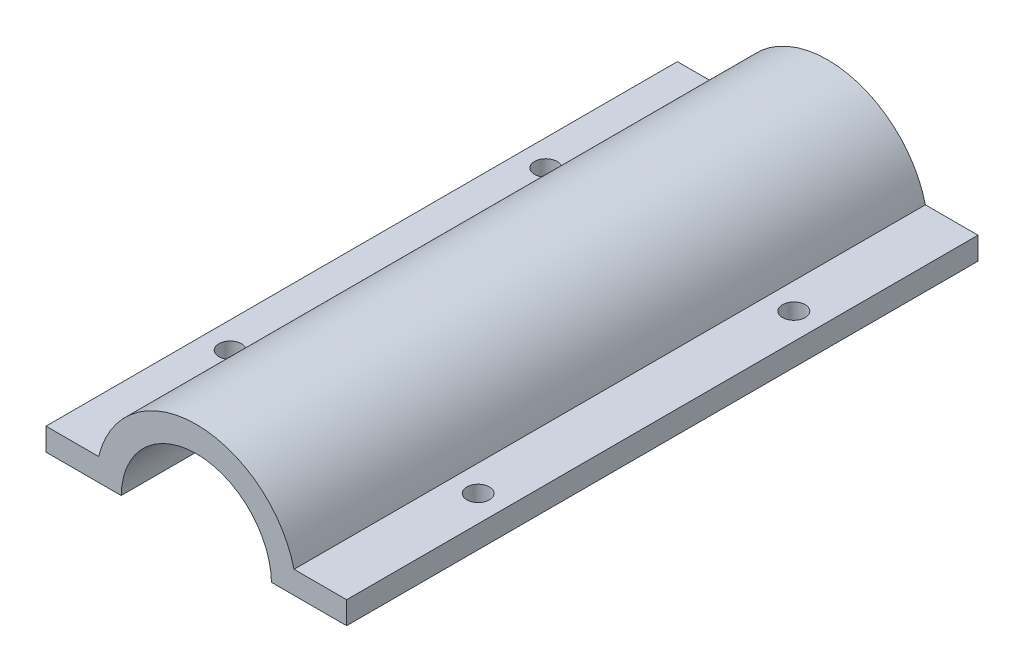
ISO-10303-21;
HEADER;
FILE_DESCRIPTION(('STEP AP214'),'2;1');
FILE_NAME('part.step','',(''),(''),'','','');
FILE_SCHEMA(('AUTOMOTIVE_DESIGN { 1 0 10303 214 1 1 1 1 }'));
ENDSEC;
DATA;
#1=APPLICATION_CONTEXT('core data for automotive mechanical design processes');
#2=APPLICATION_PROTOCOL_DEFINITION('international standard','automotive_design',2000,#1);
#3=PRODUCT_CONTEXT('',#1,'mechanical');
#4=PRODUCT('Part','Part','',(#3));
#5=PRODUCT_RELATED_PRODUCT_CATEGORY('part','',(#4));
#6=PRODUCT_DEFINITION_FORMATION('','',#4);
#7=PRODUCT_DEFINITION_CONTEXT('part definition',#1,'design');
#8=PRODUCT_DEFINITION('design','',#6,#7);
#9=PRODUCT_DEFINITION_SHAPE('','',#8);
#10=(LENGTH_UNIT() NAMED_UNIT(*) SI_UNIT(.MILLI.,.METRE.));
#11=(NAMED_UNIT(*) PLANE_ANGLE_UNIT() SI_UNIT($,.RADIAN.));
#12=(NAMED_UNIT(*) SI_UNIT($,.STERADIAN.) SOLID_ANGLE_UNIT());
#13=UNCERTAINTY_MEASURE_WITH_UNIT(LENGTH_MEASURE(1.E-05),#10,'distance_accuracy_value','');
#14=(GEOMETRIC_REPRESENTATION_CONTEXT(3) GLOBAL_UNCERTAINTY_ASSIGNED_CONTEXT((#13)) GLOBAL_UNIT_ASSIGNED_CONTEXT((#10,
#11,#12)) REPRESENTATION_CONTEXT('',''));
#15=CARTESIAN_POINT('',(0.,0.,0.));
#16=DIRECTION('',(0.,0.,1.));
#17=DIRECTION('',(1.,0.,0.));
#18=AXIS2_PLACEMENT_3D('',#15,#16,#17);
#19=CARTESIAN_POINT('',(0.,0.,84.));
#20=DIRECTION('',(0.,0.,-1.));
#21=DIRECTION('',(-1.,0.,0.));
#22=AXIS2_PLACEMENT_3D('',#19,#20,#21);
#23=CYLINDRICAL_SURFACE('',#22,10.);
#24=CARTESIAN_POINT('',(0.,0.,0.));
#25=DIRECTION('',(0.,0.,-1.));
#26=DIRECTION('',(-1.,0.,0.));
#27=AXIS2_PLACEMENT_3D('',#24,#25,#26);
#28=CIRCLE('',#27,10.);
#29=CARTESIAN_POINT('',(-9.99847695156391,0.174524064372796,0.));
#30=VERTEX_POINT('',#29);
#31=CARTESIAN_POINT('',(9.99847695156391,0.174524064372799,0.));
#32=VERTEX_POINT('',#31);
#33=EDGE_CURVE('E92',#30,#32,#28,.T.);
#34=ORIENTED_EDGE('',*,*,#33,.T.);
#35=DIRECTION('',(0.,0.,-1.));
#36=VECTOR('',#35,1.);
#37=CARTESIAN_POINT('',(9.99847695156391,0.174524064372799,84.));
#38=LINE('',#37,#36);
#39=CARTESIAN_POINT('',(9.99847695156391,0.174524064372799,84.));
#40=VERTEX_POINT('',#39);
#41=EDGE_CURVE('E11',#40,#32,#38,.T.);
#42=ORIENTED_EDGE('',*,*,#41,.F.);
#43=CARTESIAN_POINT('',(0.,0.,84.));
#44=DIRECTION('',(0.,0.,-1.));
#45=DIRECTION('',(1.,0.,0.));
#46=AXIS2_PLACEMENT_3D('',#43,#44,#45);
#47=CIRCLE('',#46,10.);
#48=CARTESIAN_POINT('',(-9.99847695156391,0.174524064372796,84.));
#49=VERTEX_POINT('',#48);
#50=EDGE_CURVE('E98',#49,#40,#47,.T.);
#51=ORIENTED_EDGE('',*,*,#50,.F.);
#52=DIRECTION('',(0.,0.,-1.));
#53=VECTOR('',#52,1.);
#54=CARTESIAN_POINT('',(-9.99847695156391,0.174524064372796,84.));
#55=LINE('',#54,#53);
#56=EDGE_CURVE('E136',#49,#30,#55,.T.);
#57=ORIENTED_EDGE('',*,*,#56,.T.);
#58=EDGE_LOOP('',(#34,#42,#51,#57));
#59=FACE_BOUND('',#58,.T.);
#60=ADVANCED_FACE('F39',(#59),#23,.F.);
#61=CARTESIAN_POINT('',(9.99847695156391,0.1745240643728,84.));
#62=DIRECTION('',(0.,1.,0.));
#63=DIRECTION('',(0.,0.,1.));
#64=AXIS2_PLACEMENT_3D('',#61,#62,#63);
#65=PLANE('',#64);
#66=CARTESIAN_POINT('',(16.4984769515639,0.174524064372796,21.));
#67=DIRECTION('',(0.,1.,0.));
#68=DIRECTION('',(0.,0.,1.));
#69=AXIS2_PLACEMENT_3D('',#66,#67,#68);
#70=CIRCLE('',#69,1.5);
#71=CARTESIAN_POINT('',(16.4984769515639,0.174524064372796,22.5));
#72=VERTEX_POINT('',#71);
#73=EDGE_CURVE('E220',#72,#72,#70,.T.);
#74=ORIENTED_EDGE('',*,*,#73,.T.);
#75=EDGE_LOOP('',(#74));
#76=FACE_BOUND('',#75,.T.);
#77=CARTESIAN_POINT('',(16.4984769515639,0.174524064372796,63.));
#78=DIRECTION('',(0.,1.,0.));
#79=DIRECTION('',(0.,0.,1.));
#80=AXIS2_PLACEMENT_3D('',#77,#78,#79);
#81=CIRCLE('',#80,1.5);
#82=CARTESIAN_POINT('',(16.4984769515639,0.174524064372796,64.5));
#83=VERTEX_POINT('',#82);
#84=EDGE_CURVE('E221',#83,#83,#81,.T.);
#85=ORIENTED_EDGE('',*,*,#84,.T.);
#86=EDGE_LOOP('',(#85));
#87=FACE_BOUND('',#86,.T.);
#88=DIRECTION('',(1.,0.,0.));
#89=VECTOR('',#88,1.);
#90=CARTESIAN_POINT('',(9.99847695156391,0.1745240643728,0.));
#91=LINE('',#90,#89);
#92=CARTESIAN_POINT('',(19.9984769515639,0.1745240643728,0.));
#93=VERTEX_POINT('',#92);
#94=EDGE_CURVE('E142',#32,#93,#91,.T.);
#95=ORIENTED_EDGE('',*,*,#94,.T.);
#96=DIRECTION('',(0.,0.,-1.));
#97=VECTOR('',#96,1.);
#98=CARTESIAN_POINT('',(19.9984769515639,0.1745240643728,84.));
#99=LINE('',#98,#97);
#100=CARTESIAN_POINT('',(19.9984769515639,0.1745240643728,84.));
#101=VERTEX_POINT('',#100);
#102=EDGE_CURVE('E48',#101,#93,#99,.T.);
#103=ORIENTED_EDGE('',*,*,#102,.F.);
#104=DIRECTION('',(1.,0.,0.));
#105=VECTOR('',#104,1.);
#106=CARTESIAN_POINT('',(9.99847695156391,0.1745240643728,84.));
#107=LINE('',#106,#105);
#108=EDGE_CURVE('E203',#40,#101,#107,.T.);
#109=ORIENTED_EDGE('',*,*,#108,.F.);
#110=ORIENTED_EDGE('',*,*,#41,.T.);
#111=EDGE_LOOP('',(#95,#103,#109,#110));
#112=FACE_BOUND('',#111,.T.);
#113=ADVANCED_FACE('F240',(#76,#87,#112),#65,.F.);
#114=CARTESIAN_POINT('',(19.9984769515639,0.1745240643728,84.));
#115=DIRECTION('',(-1.,0.,0.));
#116=DIRECTION('',(0.,0.,1.));
#117=AXIS2_PLACEMENT_3D('',#114,#115,#116);
#118=PLANE('',#117);
#119=DIRECTION('',(0.,1.,0.));
#120=VECTOR('',#119,1.);
#121=CARTESIAN_POINT('',(19.9984769515639,0.1745240643728,0.));
#122=LINE('',#121,#120);
#123=CARTESIAN_POINT('',(19.9984769515639,3.1745240643728,0.));
#124=VERTEX_POINT('',#123);
#125=EDGE_CURVE('E146',#93,#124,#122,.T.);
#126=ORIENTED_EDGE('',*,*,#125,.T.);
#127=DIRECTION('',(0.,0.,-1.));
#128=VECTOR('',#127,1.);
#129=CARTESIAN_POINT('',(19.9984769515639,3.1745240643728,84.));
#130=LINE('',#129,#128);
#131=CARTESIAN_POINT('',(19.9984769515639,3.1745240643728,84.));
#132=VERTEX_POINT('',#131);
#133=EDGE_CURVE('E173',#132,#124,#130,.T.);
#134=ORIENTED_EDGE('',*,*,#133,.F.);
#135=DIRECTION('',(0.,1.,0.));
#136=VECTOR('',#135,1.);
#137=CARTESIAN_POINT('',(19.9984769515639,0.1745240643728,84.));
#138=LINE('',#137,#136);
#139=EDGE_CURVE('E184',#101,#132,#138,.T.);
#140=ORIENTED_EDGE('',*,*,#139,.F.);
#141=ORIENTED_EDGE('',*,*,#102,.T.);
#142=EDGE_LOOP('',(#126,#134,#140,#141));
#143=FACE_BOUND('',#142,.T.);
#144=ADVANCED_FACE('F182',(#143),#118,.F.);
#145=CARTESIAN_POINT('',(19.9984769515639,3.1745240643728,84.));
#146=DIRECTION('',(0.,-1.,0.));
#147=DIRECTION('',(0.,0.,-1.));
#148=AXIS2_PLACEMENT_3D('',#145,#146,#147);
#149=PLANE('',#148);
#150=CARTESIAN_POINT('',(16.4984769515639,3.1745240643728,21.));
#151=DIRECTION('',(0.,1.,0.));
#152=DIRECTION('',(0.,0.,1.));
#153=AXIS2_PLACEMENT_3D('',#150,#151,#152);
#154=CIRCLE('',#153,1.5);
#155=CARTESIAN_POINT('',(16.4984769515639,3.1745240643728,22.5));
#156=VERTEX_POINT('',#155);
#157=EDGE_CURVE('E216',#156,#156,#154,.T.);
#158=ORIENTED_EDGE('',*,*,#157,.F.);
#159=EDGE_LOOP('',(#158));
#160=FACE_BOUND('',#159,.T.);
#161=CARTESIAN_POINT('',(16.4984769515639,3.1745240643728,63.));
#162=DIRECTION('',(0.,1.,0.));
#163=DIRECTION('',(0.,0.,1.));
#164=AXIS2_PLACEMENT_3D('',#161,#162,#163);
#165=CIRCLE('',#164,1.5);
#166=CARTESIAN_POINT('',(16.4984769515639,3.1745240643728,64.5));
#167=VERTEX_POINT('',#166);
#168=EDGE_CURVE('E232',#167,#167,#165,.T.);
#169=ORIENTED_EDGE('',*,*,#168,.F.);
#170=EDGE_LOOP('',(#169));
#171=FACE_BOUND('',#170,.T.);
#172=DIRECTION('',(-1.,0.,0.));
#173=VECTOR('',#172,1.);
#174=CARTESIAN_POINT('',(19.9984769515639,3.1745240643728,0.));
#175=LINE('',#174,#173);
#176=CARTESIAN_POINT('',(12.9984769515639,3.1745240643728,0.));
#177=VERTEX_POINT('',#176);
#178=EDGE_CURVE('E149',#124,#177,#175,.T.);
#179=ORIENTED_EDGE('',*,*,#178,.T.);
#180=DIRECTION('',(0.,0.,-1.));
#181=VECTOR('',#180,1.);
#182=CARTESIAN_POINT('',(12.9984769515639,3.1745240643728,84.));
#183=LINE('',#182,#181);
#184=CARTESIAN_POINT('',(12.9984769515639,3.1745240643728,84.));
#185=VERTEX_POINT('',#184);
#186=EDGE_CURVE('E169',#185,#177,#183,.T.);
#187=ORIENTED_EDGE('',*,*,#186,.F.);
#188=DIRECTION('',(-1.,0.,0.));
#189=VECTOR('',#188,1.);
#190=CARTESIAN_POINT('',(19.9984769515639,3.1745240643728,84.));
#191=LINE('',#190,#189);
#192=EDGE_CURVE('E197',#132,#185,#191,.T.);
#193=ORIENTED_EDGE('',*,*,#192,.F.);
#194=ORIENTED_EDGE('',*,*,#133,.T.);
#195=EDGE_LOOP('',(#179,#187,#193,#194));
#196=FACE_BOUND('',#195,.T.);
#197=ADVANCED_FACE('F192',(#160,#171,#196),#149,.F.);
#198=CARTESIAN_POINT('',(0.,0.,84.));
#199=DIRECTION('',(0.,0.,-1.));
#200=DIRECTION('',(-1.,0.,0.));
#201=AXIS2_PLACEMENT_3D('',#198,#199,#200);
#202=CYLINDRICAL_SURFACE('',#201,13.3805084393539);
#203=CARTESIAN_POINT('',(0.,0.,0.));
#204=DIRECTION('',(0.,0.,1.));
#205=DIRECTION('',(-1.,0.,0.));
#206=AXIS2_PLACEMENT_3D('',#203,#204,#205);
#207=CIRCLE('',#206,13.3805084393539);
#208=CARTESIAN_POINT('',(-12.9984769515639,3.1745240643728,0.));
#209=VERTEX_POINT('',#208);
#210=EDGE_CURVE('E152',#177,#209,#207,.T.);
#211=ORIENTED_EDGE('',*,*,#210,.T.);
#212=DIRECTION('',(0.,0.,-1.));
#213=VECTOR('',#212,1.);
#214=CARTESIAN_POINT('',(-12.9984769515639,3.1745240643728,84.));
#215=LINE('',#214,#213);
#216=CARTESIAN_POINT('',(-12.9984769515639,3.1745240643728,84.));
#217=VERTEX_POINT('',#216);
#218=EDGE_CURVE('E129',#217,#209,#215,.T.);
#219=ORIENTED_EDGE('',*,*,#218,.F.);
#220=CARTESIAN_POINT('',(0.,0.,84.));
#221=DIRECTION('',(0.,0.,1.));
#222=DIRECTION('',(-1.,0.,0.));
#223=AXIS2_PLACEMENT_3D('',#220,#221,#222);
#224=CIRCLE('',#223,13.3805084393539);
#225=EDGE_CURVE('E118',#185,#217,#224,.T.);
#226=ORIENTED_EDGE('',*,*,#225,.F.);
#227=ORIENTED_EDGE('',*,*,#186,.T.);
#228=EDGE_LOOP('',(#211,#219,#226,#227));
#229=FACE_BOUND('',#228,.T.);
#230=ADVANCED_FACE('F195',(#229),#202,.T.);
#231=CARTESIAN_POINT('',(-19.9984769515639,3.1745240643728,84.));
#232=DIRECTION('',(0.,-1.,0.));
#233=DIRECTION('',(0.,0.,-1.));
#234=AXIS2_PLACEMENT_3D('',#231,#232,#233);
#235=PLANE('',#234);
#236=CARTESIAN_POINT('',(-16.4984769515639,3.1745240643728,63.));
#237=DIRECTION('',(0.,1.,0.));
#238=DIRECTION('',(0.,0.,1.));
#239=AXIS2_PLACEMENT_3D('',#236,#237,#238);
#240=CIRCLE('',#239,1.5);
#241=CARTESIAN_POINT('',(-16.4984769515639,3.1745240643728,64.5));
#242=VERTEX_POINT('',#241);
#243=EDGE_CURVE('E225',#242,#242,#240,.T.);
#244=ORIENTED_EDGE('',*,*,#243,.F.);
#245=EDGE_LOOP('',(#244));
#246=FACE_BOUND('',#245,.T.);
#247=CARTESIAN_POINT('',(-16.4984769515639,3.1745240643728,21.));
#248=DIRECTION('',(0.,1.,0.));
#249=DIRECTION('',(0.,0.,1.));
#250=AXIS2_PLACEMENT_3D('',#247,#248,#249);
#251=CIRCLE('',#250,1.5);
#252=CARTESIAN_POINT('',(-16.4984769515639,3.1745240643728,22.5));
#253=VERTEX_POINT('',#252);
#254=EDGE_CURVE('E208',#253,#253,#251,.T.);
#255=ORIENTED_EDGE('',*,*,#254,.F.);
#256=EDGE_LOOP('',(#255));
#257=FACE_BOUND('',#256,.T.);
#258=DIRECTION('',(-1.,0.,0.));
#259=VECTOR('',#258,1.);
#260=CARTESIAN_POINT('',(-19.9984769515639,3.1745240643728,0.));
#261=LINE('',#260,#259);
#262=CARTESIAN_POINT('',(-19.9984769515639,3.1745240643728,0.));
#263=VERTEX_POINT('',#262);
#264=EDGE_CURVE('E127',#209,#263,#261,.T.);
#265=ORIENTED_EDGE('',*,*,#264,.T.);
#266=DIRECTION('',(0.,0.,-1.));
#267=VECTOR('',#266,1.);
#268=CARTESIAN_POINT('',(-19.9984769515639,3.1745240643728,84.));
#269=LINE('',#268,#267);
#270=CARTESIAN_POINT('',(-19.9984769515639,3.1745240643728,84.));
#271=VERTEX_POINT('',#270);
#272=EDGE_CURVE('E124',#271,#263,#269,.T.);
#273=ORIENTED_EDGE('',*,*,#272,.F.);
#274=DIRECTION('',(-1.,0.,0.));
#275=VECTOR('',#274,1.);
#276=CARTESIAN_POINT('',(-19.9984769515639,3.1745240643728,84.));
#277=LINE('',#276,#275);
#278=EDGE_CURVE('E112',#217,#271,#277,.T.);
#279=ORIENTED_EDGE('',*,*,#278,.F.);
#280=ORIENTED_EDGE('',*,*,#218,.T.);
#281=EDGE_LOOP('',(#265,#273,#279,#280));
#282=FACE_BOUND('',#281,.T.);
#283=ADVANCED_FACE('F125',(#246,#257,#282),#235,.F.);
#284=CARTESIAN_POINT('',(-19.9984769515639,0.174524064372796,84.));
#285=DIRECTION('',(1.,0.,0.));
#286=DIRECTION('',(0.,0.,-1.));
#287=AXIS2_PLACEMENT_3D('',#284,#285,#286);
#288=PLANE('',#287);
#289=DIRECTION('',(0.,-1.,0.));
#290=VECTOR('',#289,1.);
#291=CARTESIAN_POINT('',(-19.9984769515639,0.174524064372796,0.));
#292=LINE('',#291,#290);
#293=CARTESIAN_POINT('',(-19.9984769515639,0.174524064372796,0.));
#294=VERTEX_POINT('',#293);
#295=EDGE_CURVE('E85',#263,#294,#292,.T.);
#296=ORIENTED_EDGE('',*,*,#295,.T.);
#297=DIRECTION('',(0.,0.,-1.));
#298=VECTOR('',#297,1.);
#299=CARTESIAN_POINT('',(-19.9984769515639,0.174524064372796,84.));
#300=LINE('',#299,#298);
#301=CARTESIAN_POINT('',(-19.9984769515639,0.174524064372796,84.));
#302=VERTEX_POINT('',#301);
#303=EDGE_CURVE('E130',#302,#294,#300,.T.);
#304=ORIENTED_EDGE('',*,*,#303,.F.);
#305=DIRECTION('',(0.,-1.,0.));
#306=VECTOR('',#305,1.);
#307=CARTESIAN_POINT('',(-19.9984769515639,0.174524064372796,84.));
#308=LINE('',#307,#306);
#309=EDGE_CURVE('E116',#271,#302,#308,.T.);
#310=ORIENTED_EDGE('',*,*,#309,.F.);
#311=ORIENTED_EDGE('',*,*,#272,.T.);
#312=EDGE_LOOP('',(#296,#304,#310,#311));
#313=FACE_BOUND('',#312,.T.);
#314=ADVANCED_FACE('F132',(#313),#288,.F.);
#315=CARTESIAN_POINT('',(-9.99847695156391,0.174524064372796,84.));
#316=DIRECTION('',(0.,1.,0.));
#317=DIRECTION('',(0.,0.,1.));
#318=AXIS2_PLACEMENT_3D('',#315,#316,#317);
#319=PLANE('',#318);
#320=CARTESIAN_POINT('',(-16.4984769515639,0.174524064372796,63.));
#321=DIRECTION('',(0.,1.,0.));
#322=DIRECTION('',(0.,0.,1.));
#323=AXIS2_PLACEMENT_3D('',#320,#321,#322);
#324=CIRCLE('',#323,1.5);
#325=CARTESIAN_POINT('',(-16.4984769515639,0.174524064372796,64.5));
#326=VERTEX_POINT('',#325);
#327=EDGE_CURVE('E212',#326,#326,#324,.T.);
#328=ORIENTED_EDGE('',*,*,#327,.T.);
#329=EDGE_LOOP('',(#328));
#330=FACE_BOUND('',#329,.T.);
#331=CARTESIAN_POINT('',(-16.4984769515639,0.174524064372796,21.));
#332=DIRECTION('',(0.,1.,0.));
#333=DIRECTION('',(0.,0.,1.));
#334=AXIS2_PLACEMENT_3D('',#331,#332,#333);
#335=CIRCLE('',#334,1.5);
#336=CARTESIAN_POINT('',(-16.4984769515639,0.174524064372796,22.5));
#337=VERTEX_POINT('',#336);
#338=EDGE_CURVE('E143',#337,#337,#335,.T.);
#339=ORIENTED_EDGE('',*,*,#338,.T.);
#340=EDGE_LOOP('',(#339));
#341=FACE_BOUND('',#340,.T.);
#342=DIRECTION('',(1.,0.,0.));
#343=VECTOR('',#342,1.);
#344=CARTESIAN_POINT('',(-9.99847695156391,0.174524064372796,0.));
#345=LINE('',#344,#343);
#346=EDGE_CURVE('E159',#294,#30,#345,.T.);
#347=ORIENTED_EDGE('',*,*,#346,.T.);
#348=ORIENTED_EDGE('',*,*,#56,.F.);
#349=DIRECTION('',(1.,0.,0.));
#350=VECTOR('',#349,1.);
#351=CARTESIAN_POINT('',(-9.99847695156391,0.174524064372796,84.));
#352=LINE('',#351,#350);
#353=EDGE_CURVE('E56',#302,#49,#352,.T.);
#354=ORIENTED_EDGE('',*,*,#353,.F.);
#355=ORIENTED_EDGE('',*,*,#303,.T.);
#356=EDGE_LOOP('',(#347,#348,#354,#355));
#357=FACE_BOUND('',#356,.T.);
#358=ADVANCED_FACE('F267',(#330,#341,#357),#319,.F.);
#359=CARTESIAN_POINT('',(0.,0.,84.));
#360=DIRECTION('',(0.,0.,1.));
#361=DIRECTION('',(1.,0.,0.));
#362=AXIS2_PLACEMENT_3D('',#359,#360,#361);
#363=PLANE('',#362);
#364=ORIENTED_EDGE('',*,*,#50,.T.);
#365=ORIENTED_EDGE('',*,*,#108,.T.);
#366=ORIENTED_EDGE('',*,*,#139,.T.);
#367=ORIENTED_EDGE('',*,*,#192,.T.);
#368=ORIENTED_EDGE('',*,*,#225,.T.);
#369=ORIENTED_EDGE('',*,*,#278,.T.);
#370=ORIENTED_EDGE('',*,*,#309,.T.);
#371=ORIENTED_EDGE('',*,*,#353,.T.);
#372=EDGE_LOOP('',(#364,#365,#366,#367,#368,#369,#370,#371));
#373=FACE_BOUND('',#372,.T.);
#374=ADVANCED_FACE('F114',(#373),#363,.T.);
#375=CARTESIAN_POINT('',(0.,0.,0.));
#376=DIRECTION('',(0.,0.,1.));
#377=DIRECTION('',(1.,0.,0.));
#378=AXIS2_PLACEMENT_3D('',#375,#376,#377);
#379=PLANE('',#378);
#380=ORIENTED_EDGE('',*,*,#33,.F.);
#381=ORIENTED_EDGE('',*,*,#346,.F.);
#382=ORIENTED_EDGE('',*,*,#295,.F.);
#383=ORIENTED_EDGE('',*,*,#264,.F.);
#384=ORIENTED_EDGE('',*,*,#210,.F.);
#385=ORIENTED_EDGE('',*,*,#178,.F.);
#386=ORIENTED_EDGE('',*,*,#125,.F.);
#387=ORIENTED_EDGE('',*,*,#94,.F.);
#388=EDGE_LOOP('',(#380,#381,#382,#383,#384,#385,#386,#387));
#389=FACE_BOUND('',#388,.T.);
#390=ADVANCED_FACE('F188',(#389),#379,.F.);
#391=CARTESIAN_POINT('',(-16.4984769515639,0.174524064372796,21.));
#392=DIRECTION('',(0.,1.,0.));
#393=DIRECTION('',(0.,0.,1.));
#394=AXIS2_PLACEMENT_3D('',#391,#392,#393);
#395=CYLINDRICAL_SURFACE('',#394,1.5);
#396=ORIENTED_EDGE('',*,*,#338,.F.);
#397=EDGE_LOOP('',(#396));
#398=FACE_BOUND('',#397,.T.);
#399=ORIENTED_EDGE('',*,*,#254,.T.);
#400=EDGE_LOOP('',(#399));
#401=FACE_BOUND('',#400,.T.);
#402=ADVANCED_FACE('F288',(#398,#401),#395,.F.);
#403=CARTESIAN_POINT('',(-16.4984769515639,0.174524064372796,63.));
#404=DIRECTION('',(0.,1.,0.));
#405=DIRECTION('',(0.,0.,1.));
#406=AXIS2_PLACEMENT_3D('',#403,#404,#405);
#407=CYLINDRICAL_SURFACE('',#406,1.5);
#408=ORIENTED_EDGE('',*,*,#327,.F.);
#409=EDGE_LOOP('',(#408));
#410=FACE_BOUND('',#409,.T.);
#411=ORIENTED_EDGE('',*,*,#243,.T.);
#412=EDGE_LOOP('',(#411));
#413=FACE_BOUND('',#412,.T.);
#414=ADVANCED_FACE('F246',(#410,#413),#407,.F.);
#415=CARTESIAN_POINT('',(16.4984769515639,0.174524064372796,63.));
#416=DIRECTION('',(0.,1.,0.));
#417=DIRECTION('',(0.,0.,1.));
#418=AXIS2_PLACEMENT_3D('',#415,#416,#417);
#419=CYLINDRICAL_SURFACE('',#418,1.5);
#420=ORIENTED_EDGE('',*,*,#84,.F.);
#421=EDGE_LOOP('',(#420));
#422=FACE_BOUND('',#421,.T.);
#423=ORIENTED_EDGE('',*,*,#168,.T.);
#424=EDGE_LOOP('',(#423));
#425=FACE_BOUND('',#424,.T.);
#426=ADVANCED_FACE('F242',(#422,#425),#419,.F.);
#427=CARTESIAN_POINT('',(16.4984769515639,0.174524064372796,21.));
#428=DIRECTION('',(0.,1.,0.));
#429=DIRECTION('',(0.,0.,1.));
#430=AXIS2_PLACEMENT_3D('',#427,#428,#429);
#431=CYLINDRICAL_SURFACE('',#430,1.5);
#432=ORIENTED_EDGE('',*,*,#73,.F.);
#433=EDGE_LOOP('',(#432));
#434=FACE_BOUND('',#433,.T.);
#435=ORIENTED_EDGE('',*,*,#157,.T.);
#436=EDGE_LOOP('',(#435));
#437=FACE_BOUND('',#436,.T.);
#438=ADVANCED_FACE('F245',(#434,#437),#431,.F.);
#439=CLOSED_SHELL('',(#60,#113,#144,#197,#230,#283,#314,#358,#374,#390,#402,#414,#426,#438));
#440=MANIFOLD_SOLID_BREP('B2',#439);
#441=ADVANCED_BREP_SHAPE_REPRESENTATION('',(#18,#440),#14);
#442=SHAPE_DEFINITION_REPRESENTATION(#9,#441);
ENDSEC;
END-ISO-10303-21;
